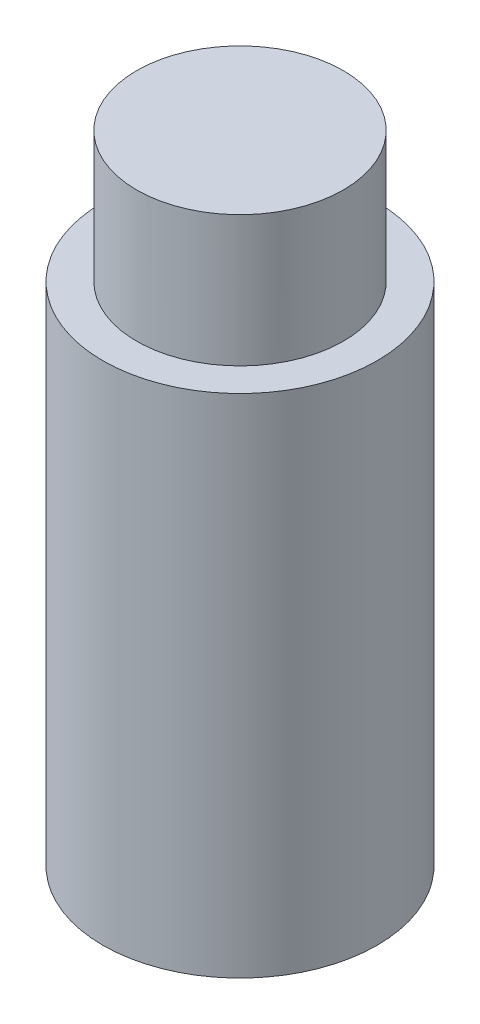
ISO-10303-21;
HEADER;
FILE_DESCRIPTION(('STEP AP214'),'2;1');
FILE_NAME('part.step','',(''),(''),'','','');
FILE_SCHEMA(('AUTOMOTIVE_DESIGN { 1 0 10303 214 1 1 1 1 }'));
ENDSEC;
DATA;
#1=APPLICATION_CONTEXT('core data for automotive mechanical design processes');
#2=APPLICATION_PROTOCOL_DEFINITION('international standard','automotive_design',2000,#1);
#3=PRODUCT_CONTEXT('',#1,'mechanical');
#4=PRODUCT('Part','Part','',(#3));
#5=PRODUCT_RELATED_PRODUCT_CATEGORY('part','',(#4));
#6=PRODUCT_DEFINITION_FORMATION('','',#4);
#7=PRODUCT_DEFINITION_CONTEXT('part definition',#1,'design');
#8=PRODUCT_DEFINITION('design','',#6,#7);
#9=PRODUCT_DEFINITION_SHAPE('','',#8);
#10=(LENGTH_UNIT() NAMED_UNIT(*) SI_UNIT(.MILLI.,.METRE.));
#11=(NAMED_UNIT(*) PLANE_ANGLE_UNIT() SI_UNIT($,.RADIAN.));
#12=(NAMED_UNIT(*) SI_UNIT($,.STERADIAN.) SOLID_ANGLE_UNIT());
#13=UNCERTAINTY_MEASURE_WITH_UNIT(LENGTH_MEASURE(1.E-05),#10,'distance_accuracy_value','');
#14=(GEOMETRIC_REPRESENTATION_CONTEXT(3) GLOBAL_UNCERTAINTY_ASSIGNED_CONTEXT((#13)) GLOBAL_UNIT_ASSIGNED_CONTEXT((#10,
#11,#12)) REPRESENTATION_CONTEXT('',''));
#15=CARTESIAN_POINT('',(0.,0.,0.));
#16=DIRECTION('',(0.,0.,1.));
#17=DIRECTION('',(1.,0.,0.));
#18=AXIS2_PLACEMENT_3D('',#15,#16,#17);
#19=CARTESIAN_POINT('',(0.,18.,0.));
#20=DIRECTION('',(0.,-1.,0.));
#21=DIRECTION('',(0.,0.,-1.));
#22=AXIS2_PLACEMENT_3D('',#19,#20,#21);
#23=CYLINDRICAL_SURFACE('',#22,2.92);
#24=CARTESIAN_POINT('',(0.,18.,0.));
#25=DIRECTION('',(0.,1.,0.));
#26=DIRECTION('',(0.,0.,1.));
#27=AXIS2_PLACEMENT_3D('',#24,#25,#26);
#28=CIRCLE('',#27,2.92);
#29=CARTESIAN_POINT('',(0.,18.,2.92));
#30=VERTEX_POINT('',#29);
#31=EDGE_CURVE('E50',#30,#30,#28,.T.);
#32=ORIENTED_EDGE('',*,*,#31,.F.);
#33=EDGE_LOOP('',(#32));
#34=FACE_BOUND('',#33,.T.);
#35=CARTESIAN_POINT('',(0.,14.3,0.));
#36=DIRECTION('',(0.,-1.,0.));
#37=DIRECTION('',(0.,0.,-1.));
#38=AXIS2_PLACEMENT_3D('',#35,#36,#37);
#39=CIRCLE('',#38,2.92);
#40=CARTESIAN_POINT('',(0.,14.3,-2.92));
#41=VERTEX_POINT('',#40);
#42=EDGE_CURVE('E10',#41,#41,#39,.T.);
#43=ORIENTED_EDGE('',*,*,#42,.F.);
#44=EDGE_LOOP('',(#43));
#45=FACE_BOUND('',#44,.T.);
#46=ADVANCED_FACE('F43',(#34,#45),#23,.T.);
#47=CARTESIAN_POINT('',(0.,18.,0.));
#48=DIRECTION('',(0.,1.,0.));
#49=DIRECTION('',(0.,0.,1.));
#50=AXIS2_PLACEMENT_3D('',#47,#48,#49);
#51=PLANE('',#50);
#52=ORIENTED_EDGE('',*,*,#31,.T.);
#53=EDGE_LOOP('',(#52));
#54=FACE_BOUND('',#53,.T.);
#55=ADVANCED_FACE('F72',(#54),#51,.T.);
#56=CARTESIAN_POINT('',(0.,14.3,0.));
#57=DIRECTION('',(0.,-1.,0.));
#58=DIRECTION('',(0.,0.,-1.));
#59=AXIS2_PLACEMENT_3D('',#56,#57,#58);
#60=CYLINDRICAL_SURFACE('',#59,3.87423064872284);
#61=CARTESIAN_POINT('',(0.,14.3,0.));
#62=DIRECTION('',(0.,-1.,0.));
#63=DIRECTION('',(0.,0.,-1.));
#64=AXIS2_PLACEMENT_3D('',#61,#62,#63);
#65=CIRCLE('',#64,3.87423064872284);
#66=CARTESIAN_POINT('',(0.,14.3,-3.87423064872284));
#67=VERTEX_POINT('',#66);
#68=EDGE_CURVE('E55',#67,#67,#65,.T.);
#69=ORIENTED_EDGE('',*,*,#68,.T.);
#70=EDGE_LOOP('',(#69));
#71=FACE_BOUND('',#70,.T.);
#72=CARTESIAN_POINT('',(0.,0.,0.));
#73=DIRECTION('',(0.,-1.,0.));
#74=DIRECTION('',(0.,0.,-1.));
#75=AXIS2_PLACEMENT_3D('',#72,#73,#74);
#76=CIRCLE('',#75,3.87423064872284);
#77=CARTESIAN_POINT('',(0.,0.,-3.87423064872284));
#78=VERTEX_POINT('',#77);
#79=EDGE_CURVE('E60',#78,#78,#76,.T.);
#80=ORIENTED_EDGE('',*,*,#79,.F.);
#81=EDGE_LOOP('',(#80));
#82=FACE_BOUND('',#81,.T.);
#83=ADVANCED_FACE('F69',(#71,#82),#60,.T.);
#84=CARTESIAN_POINT('',(0.,14.3,0.));
#85=DIRECTION('',(0.,-1.,0.));
#86=DIRECTION('',(0.,0.,-1.));
#87=AXIS2_PLACEMENT_3D('',#84,#85,#86);
#88=PLANE('',#87);
#89=ORIENTED_EDGE('',*,*,#42,.T.);
#90=EDGE_LOOP('',(#89));
#91=FACE_BOUND('',#90,.T.);
#92=ORIENTED_EDGE('',*,*,#68,.F.);
#93=EDGE_LOOP('',(#92));
#94=FACE_BOUND('',#93,.T.);
#95=ADVANCED_FACE('F71',(#91,#94),#88,.F.);
#96=CARTESIAN_POINT('',(0.,0.,0.));
#97=DIRECTION('',(0.,1.,0.));
#98=DIRECTION('',(0.,0.,1.));
#99=AXIS2_PLACEMENT_3D('',#96,#97,#98);
#100=PLANE('',#99);
#101=ORIENTED_EDGE('',*,*,#79,.T.);
#102=EDGE_LOOP('',(#101));
#103=FACE_BOUND('',#102,.T.);
#104=ADVANCED_FACE('F67',(#103),#100,.F.);
#105=CLOSED_SHELL('',(#46,#55,#83,#95,#104));
#106=MANIFOLD_SOLID_BREP('B2',#105);
#107=ADVANCED_BREP_SHAPE_REPRESENTATION('',(#18,#106),#14);
#108=SHAPE_DEFINITION_REPRESENTATION(#9,#107);
ENDSEC;
END-ISO-10303-21;
